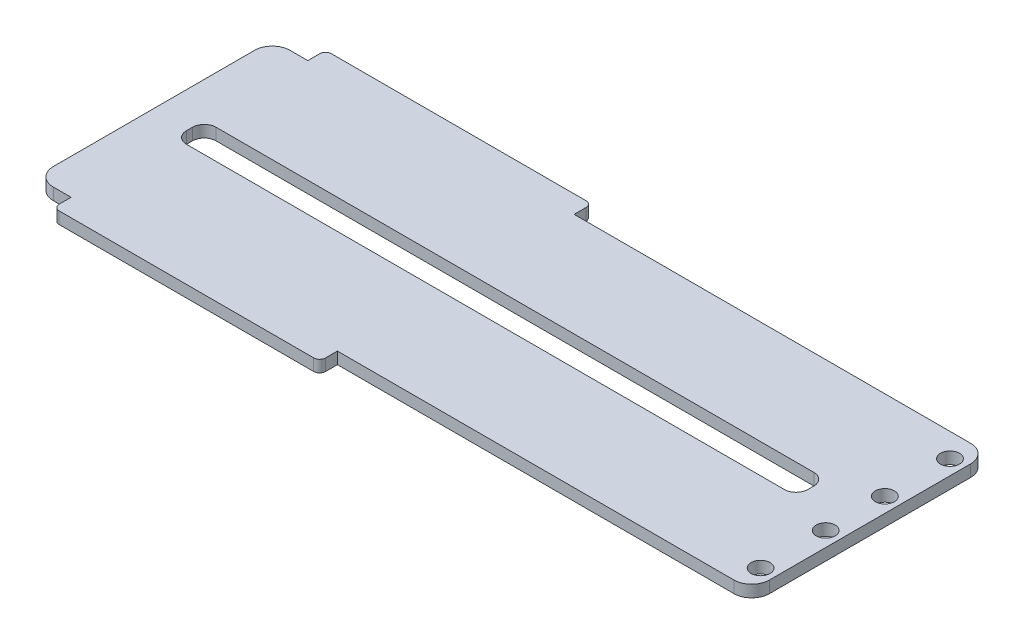
ISO-10303-21;
HEADER;
FILE_DESCRIPTION(('STEP AP214'),'2;1');
FILE_NAME('part.step','',(''),(''),'','','');
FILE_SCHEMA(('AUTOMOTIVE_DESIGN { 1 0 10303 214 1 1 1 1 }'));
ENDSEC;
DATA;
#1=APPLICATION_CONTEXT('core data for automotive mechanical design processes');
#2=APPLICATION_PROTOCOL_DEFINITION('international standard','automotive_design',2000,#1);
#3=PRODUCT_CONTEXT('',#1,'mechanical');
#4=PRODUCT('Part','Part','',(#3));
#5=PRODUCT_RELATED_PRODUCT_CATEGORY('part','',(#4));
#6=PRODUCT_DEFINITION_FORMATION('','',#4);
#7=PRODUCT_DEFINITION_CONTEXT('part definition',#1,'design');
#8=PRODUCT_DEFINITION('design','',#6,#7);
#9=PRODUCT_DEFINITION_SHAPE('','',#8);
#10=(LENGTH_UNIT() NAMED_UNIT(*) SI_UNIT(.MILLI.,.METRE.));
#11=(NAMED_UNIT(*) PLANE_ANGLE_UNIT() SI_UNIT($,.RADIAN.));
#12=(NAMED_UNIT(*) SI_UNIT($,.STERADIAN.) SOLID_ANGLE_UNIT());
#13=UNCERTAINTY_MEASURE_WITH_UNIT(LENGTH_MEASURE(1.E-05),#10,'distance_accuracy_value','');
#14=(GEOMETRIC_REPRESENTATION_CONTEXT(3) GLOBAL_UNCERTAINTY_ASSIGNED_CONTEXT((#13)) GLOBAL_UNIT_ASSIGNED_CONTEXT((#10,
#11,#12)) REPRESENTATION_CONTEXT('',''));
#15=CARTESIAN_POINT('',(0.,0.,0.));
#16=DIRECTION('',(0.,0.,1.));
#17=DIRECTION('',(1.,0.,0.));
#18=AXIS2_PLACEMENT_3D('',#15,#16,#17);
#19=CARTESIAN_POINT('',(-52.5,2.,0.));
#20=DIRECTION('',(-1.,0.,0.));
#21=DIRECTION('',(0.,0.,1.));
#22=AXIS2_PLACEMENT_3D('',#19,#20,#21);
#23=PLANE('',#22);
#24=DIRECTION('',(0.,0.,-1.));
#25=VECTOR('',#24,1.);
#26=CARTESIAN_POINT('',(-52.5,0.,0.));
#27=LINE('',#26,#25);
#28=CARTESIAN_POINT('',(-52.5,0.,0.499999999999986));
#29=VERTEX_POINT('',#28);
#30=CARTESIAN_POINT('',(-52.5,0.,-0.499999999999985));
#31=VERTEX_POINT('',#30);
#32=EDGE_CURVE('E365',#29,#31,#27,.T.);
#33=ORIENTED_EDGE('',*,*,#32,.T.);
#34=DIRECTION('',(0.,-1.,0.));
#35=VECTOR('',#34,1.);
#36=CARTESIAN_POINT('',(-52.5,2.,-0.499999999999985));
#37=LINE('',#36,#35);
#38=CARTESIAN_POINT('',(-52.5,2.,-0.499999999999985));
#39=VERTEX_POINT('',#38);
#40=EDGE_CURVE('E265',#39,#31,#37,.T.);
#41=ORIENTED_EDGE('',*,*,#40,.F.);
#42=DIRECTION('',(0.,0.,-1.));
#43=VECTOR('',#42,1.);
#44=CARTESIAN_POINT('',(-52.5,2.,0.));
#45=LINE('',#44,#43);
#46=CARTESIAN_POINT('',(-52.5,2.,0.499999999999986));
#47=VERTEX_POINT('',#46);
#48=EDGE_CURVE('E432',#47,#39,#45,.T.);
#49=ORIENTED_EDGE('',*,*,#48,.F.);
#50=DIRECTION('',(0.,-1.,0.));
#51=VECTOR('',#50,1.);
#52=CARTESIAN_POINT('',(-52.5,2.,0.499999999999986));
#53=LINE('',#52,#51);
#54=EDGE_CURVE('E251',#47,#29,#53,.T.);
#55=ORIENTED_EDGE('',*,*,#54,.T.);
#56=EDGE_LOOP('',(#33,#41,#49,#55));
#57=FACE_BOUND('',#56,.T.);
#58=ADVANCED_FACE('F37',(#57),#23,.F.);
#59=CARTESIAN_POINT('',(-50.5,2.,-0.499999999999999));
#60=DIRECTION('',(0.,-1.,0.));
#61=DIRECTION('',(0.,0.,-1.));
#62=AXIS2_PLACEMENT_3D('',#59,#60,#61);
#63=CYLINDRICAL_SURFACE('',#62,2.);
#64=CARTESIAN_POINT('',(-50.5,0.,-0.499999999999999));
#65=DIRECTION('',(0.,1.,0.));
#66=DIRECTION('',(0.,0.,1.));
#67=AXIS2_PLACEMENT_3D('',#64,#65,#66);
#68=CIRCLE('',#67,2.);
#69=CARTESIAN_POINT('',(-50.5,0.,-2.5));
#70=VERTEX_POINT('',#69);
#71=EDGE_CURVE('E368',#31,#70,#68,.F.);
#72=ORIENTED_EDGE('',*,*,#71,.T.);
#73=DIRECTION('',(0.,-1.,0.));
#74=VECTOR('',#73,1.);
#75=CARTESIAN_POINT('',(-50.5,2.,-2.5));
#76=LINE('',#75,#74);
#77=CARTESIAN_POINT('',(-50.5,2.,-2.5));
#78=VERTEX_POINT('',#77);
#79=EDGE_CURVE('E397',#78,#70,#76,.T.);
#80=ORIENTED_EDGE('',*,*,#79,.F.);
#81=CARTESIAN_POINT('',(-50.5,2.,-0.499999999999999));
#82=DIRECTION('',(0.,1.,0.));
#83=DIRECTION('',(0.,0.,1.));
#84=AXIS2_PLACEMENT_3D('',#81,#82,#83);
#85=CIRCLE('',#84,2.);
#86=EDGE_CURVE('E435',#39,#78,#85,.F.);
#87=ORIENTED_EDGE('',*,*,#86,.F.);
#88=ORIENTED_EDGE('',*,*,#40,.T.);
#89=EDGE_LOOP('',(#72,#80,#87,#88));
#90=FACE_BOUND('',#89,.T.);
#91=ADVANCED_FACE('F529',(#90),#63,.F.);
#92=CARTESIAN_POINT('',(0.,2.,-2.5));
#93=DIRECTION('',(0.,0.,-1.));
#94=DIRECTION('',(-1.,0.,0.));
#95=AXIS2_PLACEMENT_3D('',#92,#93,#94);
#96=PLANE('',#95);
#97=DIRECTION('',(1.,0.,0.));
#98=VECTOR('',#97,1.);
#99=CARTESIAN_POINT('',(0.,0.,-2.5));
#100=LINE('',#99,#98);
#101=CARTESIAN_POINT('',(50.5,0.,-2.5));
#102=VERTEX_POINT('',#101);
#103=EDGE_CURVE('E370',#70,#102,#100,.T.);
#104=ORIENTED_EDGE('',*,*,#103,.T.);
#105=DIRECTION('',(0.,-1.,0.));
#106=VECTOR('',#105,1.);
#107=CARTESIAN_POINT('',(50.5,2.,-2.5));
#108=LINE('',#107,#106);
#109=CARTESIAN_POINT('',(50.5,2.,-2.5));
#110=VERTEX_POINT('',#109);
#111=EDGE_CURVE('E394',#110,#102,#108,.T.);
#112=ORIENTED_EDGE('',*,*,#111,.F.);
#113=DIRECTION('',(1.,0.,0.));
#114=VECTOR('',#113,1.);
#115=CARTESIAN_POINT('',(0.,2.,-2.5));
#116=LINE('',#115,#114);
#117=EDGE_CURVE('E437',#78,#110,#116,.T.);
#118=ORIENTED_EDGE('',*,*,#117,.F.);
#119=ORIENTED_EDGE('',*,*,#79,.T.);
#120=EDGE_LOOP('',(#104,#112,#118,#119));
#121=FACE_BOUND('',#120,.T.);
#122=ADVANCED_FACE('F535',(#121),#96,.F.);
#123=CARTESIAN_POINT('',(50.5,2.,-0.5));
#124=DIRECTION('',(0.,-1.,0.));
#125=DIRECTION('',(0.,0.,-1.));
#126=AXIS2_PLACEMENT_3D('',#123,#124,#125);
#127=CYLINDRICAL_SURFACE('',#126,2.);
#128=CARTESIAN_POINT('',(50.5,0.,-0.5));
#129=DIRECTION('',(0.,1.,0.));
#130=DIRECTION('',(0.,0.,1.));
#131=AXIS2_PLACEMENT_3D('',#128,#129,#130);
#132=CIRCLE('',#131,2.);
#133=CARTESIAN_POINT('',(52.5,0.,-0.499999999999985));
#134=VERTEX_POINT('',#133);
#135=EDGE_CURVE('E372',#102,#134,#132,.F.);
#136=ORIENTED_EDGE('',*,*,#135,.T.);
#137=DIRECTION('',(0.,-1.,0.));
#138=VECTOR('',#137,1.);
#139=CARTESIAN_POINT('',(52.5,2.,-0.499999999999985));
#140=LINE('',#139,#138);
#141=CARTESIAN_POINT('',(52.5,2.,-0.499999999999985));
#142=VERTEX_POINT('',#141);
#143=EDGE_CURVE('E392',#142,#134,#140,.T.);
#144=ORIENTED_EDGE('',*,*,#143,.F.);
#145=CARTESIAN_POINT('',(50.5,2.,-0.5));
#146=DIRECTION('',(0.,1.,0.));
#147=DIRECTION('',(0.,0.,1.));
#148=AXIS2_PLACEMENT_3D('',#145,#146,#147);
#149=CIRCLE('',#148,2.);
#150=EDGE_CURVE('E439',#110,#142,#149,.F.);
#151=ORIENTED_EDGE('',*,*,#150,.F.);
#152=ORIENTED_EDGE('',*,*,#111,.T.);
#153=EDGE_LOOP('',(#136,#144,#151,#152));
#154=FACE_BOUND('',#153,.T.);
#155=ADVANCED_FACE('F607',(#154),#127,.F.);
#156=CARTESIAN_POINT('',(52.5,2.,0.));
#157=DIRECTION('',(-1.,0.,0.));
#158=DIRECTION('',(0.,0.,1.));
#159=AXIS2_PLACEMENT_3D('',#156,#157,#158);
#160=PLANE('',#159);
#161=DIRECTION('',(0.,0.,-1.));
#162=VECTOR('',#161,1.);
#163=CARTESIAN_POINT('',(52.5,0.,0.));
#164=LINE('',#163,#162);
#165=CARTESIAN_POINT('',(52.5,0.,0.499999999999986));
#166=VERTEX_POINT('',#165);
#167=EDGE_CURVE('E375',#166,#134,#164,.T.);
#168=ORIENTED_EDGE('',*,*,#167,.F.);
#169=DIRECTION('',(0.,-1.,0.));
#170=VECTOR('',#169,1.);
#171=CARTESIAN_POINT('',(52.5,2.,0.499999999999986));
#172=LINE('',#171,#170);
#173=CARTESIAN_POINT('',(52.5,2.,0.499999999999986));
#174=VERTEX_POINT('',#173);
#175=EDGE_CURVE('E390',#174,#166,#172,.T.);
#176=ORIENTED_EDGE('',*,*,#175,.F.);
#177=DIRECTION('',(0.,0.,-1.));
#178=VECTOR('',#177,1.);
#179=CARTESIAN_POINT('',(52.5,2.,0.));
#180=LINE('',#179,#178);
#181=EDGE_CURVE('E441',#174,#142,#180,.T.);
#182=ORIENTED_EDGE('',*,*,#181,.T.);
#183=ORIENTED_EDGE('',*,*,#143,.T.);
#184=EDGE_LOOP('',(#168,#176,#182,#183));
#185=FACE_BOUND('',#184,.T.);
#186=ADVANCED_FACE('F603',(#185),#160,.T.);
#187=CARTESIAN_POINT('',(50.5,2.,0.5));
#188=DIRECTION('',(0.,-1.,0.));
#189=DIRECTION('',(0.,0.,-1.));
#190=AXIS2_PLACEMENT_3D('',#187,#188,#189);
#191=CYLINDRICAL_SURFACE('',#190,2.);
#192=CARTESIAN_POINT('',(50.5,0.,0.5));
#193=DIRECTION('',(0.,1.,0.));
#194=DIRECTION('',(0.,0.,1.));
#195=AXIS2_PLACEMENT_3D('',#192,#193,#194);
#196=CIRCLE('',#195,2.);
#197=CARTESIAN_POINT('',(50.5,0.,2.5));
#198=VERTEX_POINT('',#197);
#199=EDGE_CURVE('E378',#198,#166,#196,.T.);
#200=ORIENTED_EDGE('',*,*,#199,.F.);
#201=DIRECTION('',(0.,-1.,0.));
#202=VECTOR('',#201,1.);
#203=CARTESIAN_POINT('',(50.5,2.,2.5));
#204=LINE('',#203,#202);
#205=CARTESIAN_POINT('',(50.5,2.,2.5));
#206=VERTEX_POINT('',#205);
#207=EDGE_CURVE('E388',#206,#198,#204,.T.);
#208=ORIENTED_EDGE('',*,*,#207,.F.);
#209=CARTESIAN_POINT('',(50.5,2.,0.5));
#210=DIRECTION('',(0.,1.,0.));
#211=DIRECTION('',(0.,0.,1.));
#212=AXIS2_PLACEMENT_3D('',#209,#210,#211);
#213=CIRCLE('',#212,2.);
#214=EDGE_CURVE('E444',#206,#174,#213,.T.);
#215=ORIENTED_EDGE('',*,*,#214,.T.);
#216=ORIENTED_EDGE('',*,*,#175,.T.);
#217=EDGE_LOOP('',(#200,#208,#215,#216));
#218=FACE_BOUND('',#217,.T.);
#219=ADVANCED_FACE('F599',(#218),#191,.F.);
#220=CARTESIAN_POINT('',(0.,2.,2.5));
#221=DIRECTION('',(0.,0.,-1.));
#222=DIRECTION('',(-1.,0.,0.));
#223=AXIS2_PLACEMENT_3D('',#220,#221,#222);
#224=PLANE('',#223);
#225=DIRECTION('',(1.,0.,0.));
#226=VECTOR('',#225,1.);
#227=CARTESIAN_POINT('',(0.,0.,2.5));
#228=LINE('',#227,#226);
#229=CARTESIAN_POINT('',(-50.5,0.,2.5));
#230=VERTEX_POINT('',#229);
#231=EDGE_CURVE('E381',#230,#198,#228,.T.);
#232=ORIENTED_EDGE('',*,*,#231,.F.);
#233=DIRECTION('',(0.,-1.,0.));
#234=VECTOR('',#233,1.);
#235=CARTESIAN_POINT('',(-50.5,2.,2.5));
#236=LINE('',#235,#234);
#237=CARTESIAN_POINT('',(-50.5,2.,2.5));
#238=VERTEX_POINT('',#237);
#239=EDGE_CURVE('E255',#238,#230,#236,.T.);
#240=ORIENTED_EDGE('',*,*,#239,.F.);
#241=DIRECTION('',(1.,0.,0.));
#242=VECTOR('',#241,1.);
#243=CARTESIAN_POINT('',(0.,2.,2.5));
#244=LINE('',#243,#242);
#245=EDGE_CURVE('E447',#238,#206,#244,.T.);
#246=ORIENTED_EDGE('',*,*,#245,.T.);
#247=ORIENTED_EDGE('',*,*,#207,.T.);
#248=EDGE_LOOP('',(#232,#240,#246,#247));
#249=FACE_BOUND('',#248,.T.);
#250=ADVANCED_FACE('F596',(#249),#224,.T.);
#251=CARTESIAN_POINT('',(0.,2.,20.));
#252=DIRECTION('',(0.,0.,-1.));
#253=DIRECTION('',(-1.,0.,0.));
#254=AXIS2_PLACEMENT_3D('',#251,#252,#253);
#255=PLANE('',#254);
#256=DIRECTION('',(1.,0.,0.));
#257=VECTOR('',#256,1.);
#258=CARTESIAN_POINT('',(0.,2.,20.));
#259=LINE('',#258,#257);
#260=CARTESIAN_POINT('',(-55.5,2.,20.));
#261=VERTEX_POINT('',#260);
#262=CARTESIAN_POINT('',(-52.5,2.,20.));
#263=VERTEX_POINT('',#262);
#264=EDGE_CURVE('E224',#261,#263,#259,.T.);
#265=ORIENTED_EDGE('',*,*,#264,.F.);
#266=DIRECTION('',(0.,1.,0.));
#267=VECTOR('',#266,1.);
#268=CARTESIAN_POINT('',(-55.5,2.,20.));
#269=LINE('',#268,#267);
#270=CARTESIAN_POINT('',(-55.5,0.,20.));
#271=VERTEX_POINT('',#270);
#272=EDGE_CURVE('E298',#261,#271,#269,.F.);
#273=ORIENTED_EDGE('',*,*,#272,.T.);
#274=DIRECTION('',(1.,0.,0.));
#275=VECTOR('',#274,1.);
#276=CARTESIAN_POINT('',(0.,0.,20.));
#277=LINE('',#276,#275);
#278=CARTESIAN_POINT('',(-52.5,0.,20.));
#279=VERTEX_POINT('',#278);
#280=EDGE_CURVE('E249',#271,#279,#277,.T.);
#281=ORIENTED_EDGE('',*,*,#280,.T.);
#282=DIRECTION('',(0.,-1.,0.));
#283=VECTOR('',#282,1.);
#284=CARTESIAN_POINT('',(-52.5,2.,20.));
#285=LINE('',#284,#283);
#286=EDGE_CURVE('E242',#263,#279,#285,.T.);
#287=ORIENTED_EDGE('',*,*,#286,.F.);
#288=EDGE_LOOP('',(#265,#273,#281,#287));
#289=FACE_BOUND('',#288,.T.);
#290=ADVANCED_FACE('F247',(#289),#255,.F.);
#291=CARTESIAN_POINT('',(-52.5,2.,-1.21430643318376E-13));
#292=DIRECTION('',(1.,0.,0.));
#293=DIRECTION('',(0.,0.,-1.));
#294=AXIS2_PLACEMENT_3D('',#291,#292,#293);
#295=PLANE('',#294);
#296=DIRECTION('',(0.,0.,1.));
#297=VECTOR('',#296,1.);
#298=CARTESIAN_POINT('',(-52.5,0.,-1.21430643318376E-13));
#299=LINE('',#298,#297);
#300=CARTESIAN_POINT('',(-52.5,0.,22.));
#301=VERTEX_POINT('',#300);
#302=EDGE_CURVE('E465',#279,#301,#299,.T.);
#303=ORIENTED_EDGE('',*,*,#302,.T.);
#304=DIRECTION('',(0.,-1.,0.));
#305=VECTOR('',#304,1.);
#306=CARTESIAN_POINT('',(-52.5,2.,22.));
#307=LINE('',#306,#305);
#308=CARTESIAN_POINT('',(-52.5,2.,22.));
#309=VERTEX_POINT('',#308);
#310=EDGE_CURVE('E244',#301,#309,#307,.F.);
#311=ORIENTED_EDGE('',*,*,#310,.T.);
#312=DIRECTION('',(0.,0.,1.));
#313=VECTOR('',#312,1.);
#314=CARTESIAN_POINT('',(-52.5,2.,-1.21430643318376E-13));
#315=LINE('',#314,#313);
#316=EDGE_CURVE('E228',#263,#309,#315,.T.);
#317=ORIENTED_EDGE('',*,*,#316,.F.);
#318=ORIENTED_EDGE('',*,*,#286,.T.);
#319=EDGE_LOOP('',(#303,#311,#317,#318));
#320=FACE_BOUND('',#319,.T.);
#321=ADVANCED_FACE('F241',(#320),#295,.F.);
#322=CARTESIAN_POINT('',(0.,2.,23.));
#323=DIRECTION('',(0.,0.,-1.));
#324=DIRECTION('',(-1.,0.,0.));
#325=AXIS2_PLACEMENT_3D('',#322,#323,#324);
#326=PLANE('',#325);
#327=DIRECTION('',(1.,0.,0.));
#328=VECTOR('',#327,1.);
#329=CARTESIAN_POINT('',(0.,2.,23.));
#330=LINE('',#329,#328);
#331=CARTESIAN_POINT('',(-51.5,2.,23.));
#332=VERTEX_POINT('',#331);
#333=CARTESIAN_POINT('',(-8.50000000000002,2.,23.));
#334=VERTEX_POINT('',#333);
#335=EDGE_CURVE('E245',#332,#334,#330,.T.);
#336=ORIENTED_EDGE('',*,*,#335,.F.);
#337=DIRECTION('',(0.,-1.,0.));
#338=VECTOR('',#337,1.);
#339=CARTESIAN_POINT('',(-51.5,2.,23.));
#340=LINE('',#339,#338);
#341=CARTESIAN_POINT('',(-51.5,0.,23.));
#342=VERTEX_POINT('',#341);
#343=EDGE_CURVE('E302',#332,#342,#340,.T.);
#344=ORIENTED_EDGE('',*,*,#343,.T.);
#345=DIRECTION('',(1.,0.,0.));
#346=VECTOR('',#345,1.);
#347=CARTESIAN_POINT('',(0.,0.,23.));
#348=LINE('',#347,#346);
#349=CARTESIAN_POINT('',(-8.50000000000002,0.,23.));
#350=VERTEX_POINT('',#349);
#351=EDGE_CURVE('E467',#342,#350,#348,.T.);
#352=ORIENTED_EDGE('',*,*,#351,.T.);
#353=DIRECTION('',(0.,-1.,0.));
#354=VECTOR('',#353,1.);
#355=CARTESIAN_POINT('',(-8.50000000000002,2.,23.));
#356=LINE('',#355,#354);
#357=EDGE_CURVE('E300',#350,#334,#356,.F.);
#358=ORIENTED_EDGE('',*,*,#357,.T.);
#359=EDGE_LOOP('',(#336,#344,#352,#358));
#360=FACE_BOUND('',#359,.T.);
#361=ADVANCED_FACE('F556',(#360),#326,.F.);
#362=CARTESIAN_POINT('',(-7.50000000000003,2.,0.));
#363=DIRECTION('',(1.,0.,0.));
#364=DIRECTION('',(0.,0.,-1.));
#365=AXIS2_PLACEMENT_3D('',#362,#363,#364);
#366=PLANE('',#365);
#367=DIRECTION('',(0.,0.,1.));
#368=VECTOR('',#367,1.);
#369=CARTESIAN_POINT('',(-7.50000000000003,2.,0.));
#370=LINE('',#369,#368);
#371=CARTESIAN_POINT('',(-7.50000000000002,2.,20.));
#372=VERTEX_POINT('',#371);
#373=CARTESIAN_POINT('',(-7.50000000000002,2.,22.));
#374=VERTEX_POINT('',#373);
#375=EDGE_CURVE('E493',#372,#374,#370,.T.);
#376=ORIENTED_EDGE('',*,*,#375,.T.);
#377=DIRECTION('',(0.,-1.,0.));
#378=VECTOR('',#377,1.);
#379=CARTESIAN_POINT('',(-7.50000000000002,0.,22.));
#380=LINE('',#379,#378);
#381=CARTESIAN_POINT('',(-7.50000000000002,0.,22.));
#382=VERTEX_POINT('',#381);
#383=EDGE_CURVE('E320',#374,#382,#380,.T.);
#384=ORIENTED_EDGE('',*,*,#383,.T.);
#385=DIRECTION('',(0.,0.,1.));
#386=VECTOR('',#385,1.);
#387=CARTESIAN_POINT('',(-7.50000000000003,0.,0.));
#388=LINE('',#387,#386);
#389=CARTESIAN_POINT('',(-7.50000000000002,0.,20.));
#390=VERTEX_POINT('',#389);
#391=EDGE_CURVE('E470',#390,#382,#388,.T.);
#392=ORIENTED_EDGE('',*,*,#391,.F.);
#393=DIRECTION('',(0.,-1.,0.));
#394=VECTOR('',#393,1.);
#395=CARTESIAN_POINT('',(-7.50000000000002,2.,20.));
#396=LINE('',#395,#394);
#397=EDGE_CURVE('E252',#372,#390,#396,.T.);
#398=ORIENTED_EDGE('',*,*,#397,.F.);
#399=EDGE_LOOP('',(#376,#384,#392,#398));
#400=FACE_BOUND('',#399,.T.);
#401=ADVANCED_FACE('F553',(#400),#366,.T.);
#402=CARTESIAN_POINT('',(59.5,0.,20.));
#403=VERTEX_POINT('',#402);
#404=EDGE_CURVE('E412',#390,#403,#277,.T.);
#405=ORIENTED_EDGE('',*,*,#404,.T.);
#406=DIRECTION('',(0.,-1.,0.));
#407=VECTOR('',#406,1.);
#408=CARTESIAN_POINT('',(59.5,2.,20.));
#409=LINE('',#408,#407);
#410=CARTESIAN_POINT('',(59.5,2.,20.));
#411=VERTEX_POINT('',#410);
#412=EDGE_CURVE('E278',#403,#411,#409,.F.);
#413=ORIENTED_EDGE('',*,*,#412,.T.);
#414=EDGE_CURVE('E237',#372,#411,#259,.T.);
#415=ORIENTED_EDGE('',*,*,#414,.F.);
#416=ORIENTED_EDGE('',*,*,#397,.T.);
#417=EDGE_LOOP('',(#405,#413,#415,#416));
#418=FACE_BOUND('',#417,.T.);
#419=ADVANCED_FACE('F477',(#418),#255,.F.);
#420=CARTESIAN_POINT('',(62.5,2.,0.));
#421=DIRECTION('',(-1.,0.,0.));
#422=DIRECTION('',(0.,0.,1.));
#423=AXIS2_PLACEMENT_3D('',#420,#421,#422);
#424=PLANE('',#423);
#425=DIRECTION('',(0.,0.,-1.));
#426=VECTOR('',#425,1.);
#427=CARTESIAN_POINT('',(62.5,2.,0.));
#428=LINE('',#427,#426);
#429=CARTESIAN_POINT('',(62.5,2.,17.));
#430=VERTEX_POINT('',#429);
#431=CARTESIAN_POINT('',(62.5,2.,-17.));
#432=VERTEX_POINT('',#431);
#433=EDGE_CURVE('E486',#430,#432,#428,.T.);
#434=ORIENTED_EDGE('',*,*,#433,.F.);
#435=DIRECTION('',(0.,-1.,0.));
#436=VECTOR('',#435,1.);
#437=CARTESIAN_POINT('',(62.5,2.,17.));
#438=LINE('',#437,#436);
#439=CARTESIAN_POINT('',(62.5,0.,17.));
#440=VERTEX_POINT('',#439);
#441=EDGE_CURVE('E267',#430,#440,#438,.T.);
#442=ORIENTED_EDGE('',*,*,#441,.T.);
#443=DIRECTION('',(0.,0.,-1.));
#444=VECTOR('',#443,1.);
#445=CARTESIAN_POINT('',(62.5,0.,0.));
#446=LINE('',#445,#444);
#447=CARTESIAN_POINT('',(62.5,0.,-17.));
#448=VERTEX_POINT('',#447);
#449=EDGE_CURVE('E410',#440,#448,#446,.T.);
#450=ORIENTED_EDGE('',*,*,#449,.T.);
#451=DIRECTION('',(0.,-1.,0.));
#452=VECTOR('',#451,1.);
#453=CARTESIAN_POINT('',(62.5,2.,-17.));
#454=LINE('',#453,#452);
#455=EDGE_CURVE('E264',#448,#432,#454,.F.);
#456=ORIENTED_EDGE('',*,*,#455,.T.);
#457=EDGE_LOOP('',(#434,#442,#450,#456));
#458=FACE_BOUND('',#457,.T.);
#459=ADVANCED_FACE('F489',(#458),#424,.F.);
#460=CARTESIAN_POINT('',(0.,2.,-20.));
#461=DIRECTION('',(0.,0.,-1.));
#462=DIRECTION('',(-1.,0.,0.));
#463=AXIS2_PLACEMENT_3D('',#460,#461,#462);
#464=PLANE('',#463);
#465=DIRECTION('',(1.,0.,0.));
#466=VECTOR('',#465,1.);
#467=CARTESIAN_POINT('',(0.,2.,-20.));
#468=LINE('',#467,#466);
#469=CARTESIAN_POINT('',(-7.50000000000002,2.,-20.));
#470=VERTEX_POINT('',#469);
#471=CARTESIAN_POINT('',(59.5,2.,-20.));
#472=VERTEX_POINT('',#471);
#473=EDGE_CURVE('E341',#470,#472,#468,.T.);
#474=ORIENTED_EDGE('',*,*,#473,.T.);
#475=DIRECTION('',(0.,-1.,0.));
#476=VECTOR('',#475,1.);
#477=CARTESIAN_POINT('',(59.5,0.,-20.));
#478=LINE('',#477,#476);
#479=CARTESIAN_POINT('',(59.5,0.,-20.));
#480=VERTEX_POINT('',#479);
#481=EDGE_CURVE('E287',#472,#480,#478,.T.);
#482=ORIENTED_EDGE('',*,*,#481,.T.);
#483=DIRECTION('',(1.,0.,0.));
#484=VECTOR('',#483,1.);
#485=CARTESIAN_POINT('',(0.,0.,-20.));
#486=LINE('',#485,#484);
#487=CARTESIAN_POINT('',(-7.50000000000002,0.,-20.));
#488=VERTEX_POINT('',#487);
#489=EDGE_CURVE('E361',#488,#480,#486,.T.);
#490=ORIENTED_EDGE('',*,*,#489,.F.);
#491=DIRECTION('',(0.,-1.,0.));
#492=VECTOR('',#491,1.);
#493=CARTESIAN_POINT('',(-7.50000000000002,2.,-20.));
#494=LINE('',#493,#492);
#495=EDGE_CURVE('E257',#470,#488,#494,.T.);
#496=ORIENTED_EDGE('',*,*,#495,.F.);
#497=EDGE_LOOP('',(#474,#482,#490,#496));
#498=FACE_BOUND('',#497,.T.);
#499=ADVANCED_FACE('F408',(#498),#464,.T.);
#500=CARTESIAN_POINT('',(-7.50000000000002,2.,0.));
#501=DIRECTION('',(-1.,0.,0.));
#502=DIRECTION('',(0.,0.,1.));
#503=AXIS2_PLACEMENT_3D('',#500,#501,#502);
#504=PLANE('',#503);
#505=DIRECTION('',(0.,0.,-1.));
#506=VECTOR('',#505,1.);
#507=CARTESIAN_POINT('',(-7.50000000000002,0.,0.));
#508=LINE('',#507,#506);
#509=CARTESIAN_POINT('',(-7.50000000000002,0.,-22.));
#510=VERTEX_POINT('',#509);
#511=EDGE_CURVE('E336',#488,#510,#508,.T.);
#512=ORIENTED_EDGE('',*,*,#511,.T.);
#513=DIRECTION('',(0.,-1.,0.));
#514=VECTOR('',#513,1.);
#515=CARTESIAN_POINT('',(-7.50000000000002,2.,-22.));
#516=LINE('',#515,#514);
#517=CARTESIAN_POINT('',(-7.50000000000002,2.,-22.));
#518=VERTEX_POINT('',#517);
#519=EDGE_CURVE('E45',#510,#518,#516,.F.);
#520=ORIENTED_EDGE('',*,*,#519,.T.);
#521=DIRECTION('',(0.,0.,-1.));
#522=VECTOR('',#521,1.);
#523=CARTESIAN_POINT('',(-7.50000000000002,2.,0.));
#524=LINE('',#523,#522);
#525=EDGE_CURVE('E333',#470,#518,#524,.T.);
#526=ORIENTED_EDGE('',*,*,#525,.F.);
#527=ORIENTED_EDGE('',*,*,#495,.T.);
#528=EDGE_LOOP('',(#512,#520,#526,#527));
#529=FACE_BOUND('',#528,.T.);
#530=ADVANCED_FACE('F332',(#529),#504,.F.);
#531=CARTESIAN_POINT('',(0.,2.,-23.));
#532=DIRECTION('',(0.,0.,-1.));
#533=DIRECTION('',(-1.,0.,0.));
#534=AXIS2_PLACEMENT_3D('',#531,#532,#533);
#535=PLANE('',#534);
#536=DIRECTION('',(1.,0.,0.));
#537=VECTOR('',#536,1.);
#538=CARTESIAN_POINT('',(0.,2.,-23.));
#539=LINE('',#538,#537);
#540=CARTESIAN_POINT('',(-51.5,2.,-23.));
#541=VERTEX_POINT('',#540);
#542=CARTESIAN_POINT('',(-8.50000000000002,2.,-23.));
#543=VERTEX_POINT('',#542);
#544=EDGE_CURVE('E342',#541,#543,#539,.T.);
#545=ORIENTED_EDGE('',*,*,#544,.T.);
#546=DIRECTION('',(0.,-1.,0.));
#547=VECTOR('',#546,1.);
#548=CARTESIAN_POINT('',(-8.50000000000002,0.,-23.));
#549=LINE('',#548,#547);
#550=CARTESIAN_POINT('',(-8.50000000000002,0.,-23.));
#551=VERTEX_POINT('',#550);
#552=EDGE_CURVE('E325',#543,#551,#549,.T.);
#553=ORIENTED_EDGE('',*,*,#552,.T.);
#554=DIRECTION('',(1.,0.,0.));
#555=VECTOR('',#554,1.);
#556=CARTESIAN_POINT('',(0.,0.,-23.));
#557=LINE('',#556,#555);
#558=CARTESIAN_POINT('',(-51.5,0.,-23.));
#559=VERTEX_POINT('',#558);
#560=EDGE_CURVE('E350',#559,#551,#557,.T.);
#561=ORIENTED_EDGE('',*,*,#560,.F.);
#562=DIRECTION('',(0.,-1.,0.));
#563=VECTOR('',#562,1.);
#564=CARTESIAN_POINT('',(-51.5,2.,-23.));
#565=LINE('',#564,#563);
#566=EDGE_CURVE('E323',#559,#541,#565,.F.);
#567=ORIENTED_EDGE('',*,*,#566,.T.);
#568=EDGE_LOOP('',(#545,#553,#561,#567));
#569=FACE_BOUND('',#568,.T.);
#570=ADVANCED_FACE('F349',(#569),#535,.T.);
#571=CARTESIAN_POINT('',(-52.5,2.,1.21430643318376E-13));
#572=DIRECTION('',(-1.,0.,0.));
#573=DIRECTION('',(0.,0.,1.));
#574=AXIS2_PLACEMENT_3D('',#571,#572,#573);
#575=PLANE('',#574);
#576=DIRECTION('',(0.,0.,-1.));
#577=VECTOR('',#576,1.);
#578=CARTESIAN_POINT('',(-52.5,2.,1.21430643318376E-13));
#579=LINE('',#578,#577);
#580=CARTESIAN_POINT('',(-52.5,2.,-20.));
#581=VERTEX_POINT('',#580);
#582=CARTESIAN_POINT('',(-52.5,2.,-22.));
#583=VERTEX_POINT('',#582);
#584=EDGE_CURVE('E426',#581,#583,#579,.T.);
#585=ORIENTED_EDGE('',*,*,#584,.T.);
#586=DIRECTION('',(0.,-1.,0.));
#587=VECTOR('',#586,1.);
#588=CARTESIAN_POINT('',(-52.5,2.,-22.));
#589=LINE('',#588,#587);
#590=CARTESIAN_POINT('',(-52.5,0.,-22.));
#591=VERTEX_POINT('',#590);
#592=EDGE_CURVE('E11',#583,#591,#589,.T.);
#593=ORIENTED_EDGE('',*,*,#592,.T.);
#594=DIRECTION('',(0.,0.,-1.));
#595=VECTOR('',#594,1.);
#596=CARTESIAN_POINT('',(-52.5,0.,1.21430643318376E-13));
#597=LINE('',#596,#595);
#598=CARTESIAN_POINT('',(-52.5,0.,-20.));
#599=VERTEX_POINT('',#598);
#600=EDGE_CURVE('E357',#599,#591,#597,.T.);
#601=ORIENTED_EDGE('',*,*,#600,.F.);
#602=DIRECTION('',(0.,-1.,0.));
#603=VECTOR('',#602,1.);
#604=CARTESIAN_POINT('',(-52.5,2.,-20.));
#605=LINE('',#604,#603);
#606=EDGE_CURVE('E402',#581,#599,#605,.T.);
#607=ORIENTED_EDGE('',*,*,#606,.F.);
#608=EDGE_LOOP('',(#585,#593,#601,#607));
#609=FACE_BOUND('',#608,.T.);
#610=ADVANCED_FACE('F424',(#609),#575,.T.);
#611=CARTESIAN_POINT('',(-55.5,0.,-20.));
#612=VERTEX_POINT('',#611);
#613=EDGE_CURVE('E359',#612,#599,#486,.T.);
#614=ORIENTED_EDGE('',*,*,#613,.F.);
#615=DIRECTION('',(0.,1.,0.));
#616=VECTOR('',#615,1.);
#617=CARTESIAN_POINT('',(-55.5,2.,-20.));
#618=LINE('',#617,#616);
#619=CARTESIAN_POINT('',(-55.5,2.,-20.));
#620=VERTEX_POINT('',#619);
#621=EDGE_CURVE('E290',#612,#620,#618,.T.);
#622=ORIENTED_EDGE('',*,*,#621,.T.);
#623=EDGE_CURVE('E422',#620,#581,#468,.T.);
#624=ORIENTED_EDGE('',*,*,#623,.T.);
#625=ORIENTED_EDGE('',*,*,#606,.T.);
#626=EDGE_LOOP('',(#614,#622,#624,#625));
#627=FACE_BOUND('',#626,.T.);
#628=ADVANCED_FACE('F420',(#627),#464,.T.);
#629=CARTESIAN_POINT('',(60.,2.,-16.));
#630=DIRECTION('',(0.,-1.,0.));
#631=DIRECTION('',(0.,0.,-1.));
#632=AXIS2_PLACEMENT_3D('',#629,#630,#631);
#633=CYLINDRICAL_SURFACE('',#632,1.6);
#634=CARTESIAN_POINT('',(60.,2.,-16.));
#635=DIRECTION('',(0.,1.,0.));
#636=DIRECTION('',(0.,0.,1.));
#637=AXIS2_PLACEMENT_3D('',#634,#635,#636);
#638=CIRCLE('',#637,1.6);
#639=CARTESIAN_POINT('',(60.,2.,-14.4));
#640=VERTEX_POINT('',#639);
#641=EDGE_CURVE('E235',#640,#640,#638,.T.);
#642=ORIENTED_EDGE('',*,*,#641,.T.);
#643=EDGE_LOOP('',(#642));
#644=FACE_BOUND('',#643,.T.);
#645=CARTESIAN_POINT('',(60.,0.,-16.));
#646=DIRECTION('',(0.,1.,0.));
#647=DIRECTION('',(0.,0.,1.));
#648=AXIS2_PLACEMENT_3D('',#645,#646,#647);
#649=CIRCLE('',#648,1.6);
#650=CARTESIAN_POINT('',(60.,0.,-14.4));
#651=VERTEX_POINT('',#650);
#652=EDGE_CURVE('E461',#651,#651,#649,.T.);
#653=ORIENTED_EDGE('',*,*,#652,.F.);
#654=EDGE_LOOP('',(#653));
#655=FACE_BOUND('',#654,.T.);
#656=ADVANCED_FACE('F542',(#644,#655),#633,.F.);
#657=CARTESIAN_POINT('',(60.,2.,-5.));
#658=DIRECTION('',(0.,-1.,0.));
#659=DIRECTION('',(0.,0.,-1.));
#660=AXIS2_PLACEMENT_3D('',#657,#658,#659);
#661=CYLINDRICAL_SURFACE('',#660,1.6);
#662=CARTESIAN_POINT('',(60.,2.,-5.));
#663=DIRECTION('',(0.,1.,0.));
#664=DIRECTION('',(0.,0.,1.));
#665=AXIS2_PLACEMENT_3D('',#662,#663,#664);
#666=CIRCLE('',#665,1.6);
#667=CARTESIAN_POINT('',(60.,2.,-3.4));
#668=VERTEX_POINT('',#667);
#669=EDGE_CURVE('E499',#668,#668,#666,.T.);
#670=ORIENTED_EDGE('',*,*,#669,.T.);
#671=EDGE_LOOP('',(#670));
#672=FACE_BOUND('',#671,.T.);
#673=CARTESIAN_POINT('',(60.,0.,-5.));
#674=DIRECTION('',(0.,1.,0.));
#675=DIRECTION('',(0.,0.,1.));
#676=AXIS2_PLACEMENT_3D('',#673,#674,#675);
#677=CIRCLE('',#676,1.6);
#678=CARTESIAN_POINT('',(60.,0.,-3.4));
#679=VERTEX_POINT('',#678);
#680=EDGE_CURVE('E458',#679,#679,#677,.T.);
#681=ORIENTED_EDGE('',*,*,#680,.F.);
#682=EDGE_LOOP('',(#681));
#683=FACE_BOUND('',#682,.T.);
#684=ADVANCED_FACE('F565',(#672,#683),#661,.F.);
#685=CARTESIAN_POINT('',(60.,2.,5.));
#686=DIRECTION('',(0.,-1.,0.));
#687=DIRECTION('',(0.,0.,-1.));
#688=AXIS2_PLACEMENT_3D('',#685,#686,#687);
#689=CYLINDRICAL_SURFACE('',#688,1.6);
#690=CARTESIAN_POINT('',(60.,2.,5.));
#691=DIRECTION('',(0.,1.,0.));
#692=DIRECTION('',(0.,0.,1.));
#693=AXIS2_PLACEMENT_3D('',#690,#691,#692);
#694=CIRCLE('',#693,1.6);
#695=CARTESIAN_POINT('',(60.,2.,6.6));
#696=VERTEX_POINT('',#695);
#697=EDGE_CURVE('E502',#696,#696,#694,.T.);
#698=ORIENTED_EDGE('',*,*,#697,.T.);
#699=EDGE_LOOP('',(#698));
#700=FACE_BOUND('',#699,.T.);
#701=CARTESIAN_POINT('',(60.,0.,5.));
#702=DIRECTION('',(0.,1.,0.));
#703=DIRECTION('',(0.,0.,1.));
#704=AXIS2_PLACEMENT_3D('',#701,#702,#703);
#705=CIRCLE('',#704,1.6);
#706=CARTESIAN_POINT('',(60.,0.,6.6));
#707=VERTEX_POINT('',#706);
#708=EDGE_CURVE('E454',#707,#707,#705,.T.);
#709=ORIENTED_EDGE('',*,*,#708,.F.);
#710=EDGE_LOOP('',(#709));
#711=FACE_BOUND('',#710,.T.);
#712=ADVANCED_FACE('F569',(#700,#711),#689,.F.);
#713=CARTESIAN_POINT('',(60.,2.,16.));
#714=DIRECTION('',(0.,-1.,0.));
#715=DIRECTION('',(0.,0.,-1.));
#716=AXIS2_PLACEMENT_3D('',#713,#714,#715);
#717=CYLINDRICAL_SURFACE('',#716,1.6);
#718=CARTESIAN_POINT('',(60.,2.,16.));
#719=DIRECTION('',(0.,1.,0.));
#720=DIRECTION('',(0.,0.,1.));
#721=AXIS2_PLACEMENT_3D('',#718,#719,#720);
#722=CIRCLE('',#721,1.6);
#723=CARTESIAN_POINT('',(60.,2.,17.6));
#724=VERTEX_POINT('',#723);
#725=EDGE_CURVE('E385',#724,#724,#722,.T.);
#726=ORIENTED_EDGE('',*,*,#725,.T.);
#727=EDGE_LOOP('',(#726));
#728=FACE_BOUND('',#727,.T.);
#729=CARTESIAN_POINT('',(60.,0.,16.));
#730=DIRECTION('',(0.,1.,0.));
#731=DIRECTION('',(0.,0.,1.));
#732=AXIS2_PLACEMENT_3D('',#729,#730,#731);
#733=CIRCLE('',#732,1.6);
#734=CARTESIAN_POINT('',(60.,0.,17.6));
#735=VERTEX_POINT('',#734);
#736=EDGE_CURVE('E451',#735,#735,#733,.T.);
#737=ORIENTED_EDGE('',*,*,#736,.F.);
#738=EDGE_LOOP('',(#737));
#739=FACE_BOUND('',#738,.T.);
#740=ADVANCED_FACE('F573',(#728,#739),#717,.F.);
#741=CARTESIAN_POINT('',(-50.5,2.,0.5));
#742=DIRECTION('',(0.,-1.,0.));
#743=DIRECTION('',(0.,0.,-1.));
#744=AXIS2_PLACEMENT_3D('',#741,#742,#743);
#745=CYLINDRICAL_SURFACE('',#744,2.);
#746=CARTESIAN_POINT('',(-50.5,0.,0.5));
#747=DIRECTION('',(0.,1.,0.));
#748=DIRECTION('',(0.,0.,1.));
#749=AXIS2_PLACEMENT_3D('',#746,#747,#748);
#750=CIRCLE('',#749,2.);
#751=EDGE_CURVE('E384',#230,#29,#750,.F.);
#752=ORIENTED_EDGE('',*,*,#751,.T.);
#753=ORIENTED_EDGE('',*,*,#54,.F.);
#754=CARTESIAN_POINT('',(-50.5,2.,0.5));
#755=DIRECTION('',(0.,1.,0.));
#756=DIRECTION('',(0.,0.,1.));
#757=AXIS2_PLACEMENT_3D('',#754,#755,#756);
#758=CIRCLE('',#757,2.);
#759=EDGE_CURVE('E404',#238,#47,#758,.F.);
#760=ORIENTED_EDGE('',*,*,#759,.F.);
#761=ORIENTED_EDGE('',*,*,#239,.T.);
#762=EDGE_LOOP('',(#752,#753,#760,#761));
#763=FACE_BOUND('',#762,.T.);
#764=ADVANCED_FACE('F577',(#763),#745,.F.);
#765=CARTESIAN_POINT('',(0.,2.,0.));
#766=DIRECTION('',(0.,1.,0.));
#767=DIRECTION('',(0.,0.,1.));
#768=AXIS2_PLACEMENT_3D('',#765,#766,#767);
#769=PLANE('',#768);
#770=ORIENTED_EDGE('',*,*,#316,.T.);
#771=CARTESIAN_POINT('',(-51.5,2.,22.));
#772=DIRECTION('',(0.,1.,0.));
#773=DIRECTION('',(0.,0.,1.));
#774=AXIS2_PLACEMENT_3D('',#771,#772,#773);
#775=CIRCLE('',#774,1.);
#776=EDGE_CURVE('E318',#309,#332,#775,.T.);
#777=ORIENTED_EDGE('',*,*,#776,.T.);
#778=ORIENTED_EDGE('',*,*,#335,.T.);
#779=CARTESIAN_POINT('',(-8.50000000000002,2.,22.));
#780=DIRECTION('',(0.,1.,0.));
#781=DIRECTION('',(0.,0.,1.));
#782=AXIS2_PLACEMENT_3D('',#779,#780,#781);
#783=CIRCLE('',#782,1.);
#784=EDGE_CURVE('E52',#334,#374,#783,.T.);
#785=ORIENTED_EDGE('',*,*,#784,.T.);
#786=ORIENTED_EDGE('',*,*,#375,.F.);
#787=ORIENTED_EDGE('',*,*,#414,.T.);
#788=CARTESIAN_POINT('',(59.5,2.,17.));
#789=DIRECTION('',(0.,1.,0.));
#790=DIRECTION('',(0.,0.,1.));
#791=AXIS2_PLACEMENT_3D('',#788,#789,#790);
#792=CIRCLE('',#791,3.);
#793=EDGE_CURVE('E285',#411,#430,#792,.T.);
#794=ORIENTED_EDGE('',*,*,#793,.T.);
#795=ORIENTED_EDGE('',*,*,#433,.T.);
#796=CARTESIAN_POINT('',(59.5,2.,-17.));
#797=DIRECTION('',(0.,1.,0.));
#798=DIRECTION('',(0.,0.,1.));
#799=AXIS2_PLACEMENT_3D('',#796,#797,#798);
#800=CIRCLE('',#799,3.);
#801=EDGE_CURVE('E283',#432,#472,#800,.T.);
#802=ORIENTED_EDGE('',*,*,#801,.T.);
#803=ORIENTED_EDGE('',*,*,#473,.F.);
#804=ORIENTED_EDGE('',*,*,#525,.T.);
#805=CARTESIAN_POINT('',(-8.50000000000002,2.,-22.));
#806=DIRECTION('',(0.,1.,0.));
#807=DIRECTION('',(0.,0.,1.));
#808=AXIS2_PLACEMENT_3D('',#805,#806,#807);
#809=CIRCLE('',#808,1.);
#810=EDGE_CURVE('E315',#518,#543,#809,.T.);
#811=ORIENTED_EDGE('',*,*,#810,.T.);
#812=ORIENTED_EDGE('',*,*,#544,.F.);
#813=CARTESIAN_POINT('',(-51.5,2.,-22.));
#814=DIRECTION('',(0.,1.,0.));
#815=DIRECTION('',(0.,0.,1.));
#816=AXIS2_PLACEMENT_3D('',#813,#814,#815);
#817=CIRCLE('',#816,1.);
#818=EDGE_CURVE('E59',#541,#583,#817,.T.);
#819=ORIENTED_EDGE('',*,*,#818,.T.);
#820=ORIENTED_EDGE('',*,*,#584,.F.);
#821=ORIENTED_EDGE('',*,*,#623,.F.);
#822=CARTESIAN_POINT('',(-55.5,2.,-17.));
#823=DIRECTION('',(0.,1.,0.));
#824=DIRECTION('',(0.,0.,1.));
#825=AXIS2_PLACEMENT_3D('',#822,#823,#824);
#826=CIRCLE('',#825,3.);
#827=CARTESIAN_POINT('',(-58.5,2.,-17.));
#828=VERTEX_POINT('',#827);
#829=EDGE_CURVE('E281',#620,#828,#826,.T.);
#830=ORIENTED_EDGE('',*,*,#829,.T.);
#831=DIRECTION('',(0.,0.,-1.));
#832=VECTOR('',#831,1.);
#833=CARTESIAN_POINT('',(-58.5,2.,-20.));
#834=LINE('',#833,#832);
#835=CARTESIAN_POINT('',(-58.5,2.,17.));
#836=VERTEX_POINT('',#835);
#837=EDGE_CURVE('E455',#836,#828,#834,.T.);
#838=ORIENTED_EDGE('',*,*,#837,.F.);
#839=CARTESIAN_POINT('',(-55.5,2.,17.));
#840=DIRECTION('',(0.,1.,0.));
#841=DIRECTION('',(0.,0.,1.));
#842=AXIS2_PLACEMENT_3D('',#839,#840,#841);
#843=CIRCLE('',#842,3.);
#844=EDGE_CURVE('E231',#836,#261,#843,.T.);
#845=ORIENTED_EDGE('',*,*,#844,.T.);
#846=ORIENTED_EDGE('',*,*,#264,.T.);
#847=EDGE_LOOP('',(#770,#777,#778,#785,#786,#787,#794,#795,#802,#803,#804,#811,#812,#819,#820,
#821,#830,#838,#845,#846));
#848=FACE_BOUND('',#847,.T.);
#849=ORIENTED_EDGE('',*,*,#725,.F.);
#850=EDGE_LOOP('',(#849));
#851=FACE_BOUND('',#850,.T.);
#852=ORIENTED_EDGE('',*,*,#697,.F.);
#853=EDGE_LOOP('',(#852));
#854=FACE_BOUND('',#853,.T.);
#855=ORIENTED_EDGE('',*,*,#669,.F.);
#856=EDGE_LOOP('',(#855));
#857=FACE_BOUND('',#856,.T.);
#858=ORIENTED_EDGE('',*,*,#641,.F.);
#859=EDGE_LOOP('',(#858));
#860=FACE_BOUND('',#859,.T.);
#861=ORIENTED_EDGE('',*,*,#48,.T.);
#862=ORIENTED_EDGE('',*,*,#86,.T.);
#863=ORIENTED_EDGE('',*,*,#117,.T.);
#864=ORIENTED_EDGE('',*,*,#150,.T.);
#865=ORIENTED_EDGE('',*,*,#181,.F.);
#866=ORIENTED_EDGE('',*,*,#214,.F.);
#867=ORIENTED_EDGE('',*,*,#245,.F.);
#868=ORIENTED_EDGE('',*,*,#759,.T.);
#869=EDGE_LOOP('',(#861,#862,#863,#864,#865,#866,#867,#868));
#870=FACE_BOUND('',#869,.T.);
#871=ADVANCED_FACE('F226',(#848,#851,#854,#857,#860,#870),#769,.T.);
#872=CARTESIAN_POINT('',(0.,0.,0.));
#873=DIRECTION('',(0.,1.,0.));
#874=DIRECTION('',(0.,0.,1.));
#875=AXIS2_PLACEMENT_3D('',#872,#873,#874);
#876=PLANE('',#875);
#877=ORIENTED_EDGE('',*,*,#736,.T.);
#878=EDGE_LOOP('',(#877));
#879=FACE_BOUND('',#878,.T.);
#880=ORIENTED_EDGE('',*,*,#708,.T.);
#881=EDGE_LOOP('',(#880));
#882=FACE_BOUND('',#881,.T.);
#883=ORIENTED_EDGE('',*,*,#680,.T.);
#884=EDGE_LOOP('',(#883));
#885=FACE_BOUND('',#884,.T.);
#886=ORIENTED_EDGE('',*,*,#652,.T.);
#887=EDGE_LOOP('',(#886));
#888=FACE_BOUND('',#887,.T.);
#889=ORIENTED_EDGE('',*,*,#351,.F.);
#890=CARTESIAN_POINT('',(-51.5,0.,22.));
#891=DIRECTION('',(0.,1.,0.));
#892=DIRECTION('',(0.,0.,1.));
#893=AXIS2_PLACEMENT_3D('',#890,#891,#892);
#894=CIRCLE('',#893,1.);
#895=EDGE_CURVE('E311',#342,#301,#894,.F.);
#896=ORIENTED_EDGE('',*,*,#895,.T.);
#897=ORIENTED_EDGE('',*,*,#302,.F.);
#898=ORIENTED_EDGE('',*,*,#280,.F.);
#899=CARTESIAN_POINT('',(-55.5,0.,17.));
#900=DIRECTION('',(0.,1.,0.));
#901=DIRECTION('',(0.,0.,1.));
#902=AXIS2_PLACEMENT_3D('',#899,#900,#901);
#903=CIRCLE('',#902,3.);
#904=CARTESIAN_POINT('',(-58.5,0.,17.));
#905=VERTEX_POINT('',#904);
#906=EDGE_CURVE('E270',#271,#905,#903,.F.);
#907=ORIENTED_EDGE('',*,*,#906,.T.);
#908=DIRECTION('',(0.,0.,-1.));
#909=VECTOR('',#908,1.);
#910=CARTESIAN_POINT('',(-58.5,0.,0.));
#911=LINE('',#910,#909);
#912=CARTESIAN_POINT('',(-58.5,0.,-17.));
#913=VERTEX_POINT('',#912);
#914=EDGE_CURVE('E261',#905,#913,#911,.T.);
#915=ORIENTED_EDGE('',*,*,#914,.T.);
#916=CARTESIAN_POINT('',(-55.5,0.,-17.));
#917=DIRECTION('',(0.,1.,0.));
#918=DIRECTION('',(0.,0.,1.));
#919=AXIS2_PLACEMENT_3D('',#916,#917,#918);
#920=CIRCLE('',#919,3.);
#921=EDGE_CURVE('E272',#913,#612,#920,.F.);
#922=ORIENTED_EDGE('',*,*,#921,.T.);
#923=ORIENTED_EDGE('',*,*,#613,.T.);
#924=ORIENTED_EDGE('',*,*,#600,.T.);
#925=CARTESIAN_POINT('',(-51.5,0.,-22.));
#926=DIRECTION('',(0.,1.,0.));
#927=DIRECTION('',(0.,0.,1.));
#928=AXIS2_PLACEMENT_3D('',#925,#926,#927);
#929=CIRCLE('',#928,1.);
#930=EDGE_CURVE('E305',#591,#559,#929,.F.);
#931=ORIENTED_EDGE('',*,*,#930,.T.);
#932=ORIENTED_EDGE('',*,*,#560,.T.);
#933=CARTESIAN_POINT('',(-8.50000000000002,0.,-22.));
#934=DIRECTION('',(0.,1.,0.));
#935=DIRECTION('',(0.,0.,1.));
#936=AXIS2_PLACEMENT_3D('',#933,#934,#935);
#937=CIRCLE('',#936,1.);
#938=EDGE_CURVE('E307',#551,#510,#937,.F.);
#939=ORIENTED_EDGE('',*,*,#938,.T.);
#940=ORIENTED_EDGE('',*,*,#511,.F.);
#941=ORIENTED_EDGE('',*,*,#489,.T.);
#942=CARTESIAN_POINT('',(59.5,0.,-17.));
#943=DIRECTION('',(0.,1.,0.));
#944=DIRECTION('',(0.,0.,1.));
#945=AXIS2_PLACEMENT_3D('',#942,#943,#944);
#946=CIRCLE('',#945,3.);
#947=EDGE_CURVE('E274',#480,#448,#946,.F.);
#948=ORIENTED_EDGE('',*,*,#947,.T.);
#949=ORIENTED_EDGE('',*,*,#449,.F.);
#950=CARTESIAN_POINT('',(59.5,0.,17.));
#951=DIRECTION('',(0.,1.,0.));
#952=DIRECTION('',(0.,0.,1.));
#953=AXIS2_PLACEMENT_3D('',#950,#951,#952);
#954=CIRCLE('',#953,3.);
#955=EDGE_CURVE('E276',#440,#403,#954,.F.);
#956=ORIENTED_EDGE('',*,*,#955,.T.);
#957=ORIENTED_EDGE('',*,*,#404,.F.);
#958=ORIENTED_EDGE('',*,*,#391,.T.);
#959=CARTESIAN_POINT('',(-8.50000000000002,0.,22.));
#960=DIRECTION('',(0.,1.,0.));
#961=DIRECTION('',(0.,0.,1.));
#962=AXIS2_PLACEMENT_3D('',#959,#960,#961);
#963=CIRCLE('',#962,1.);
#964=EDGE_CURVE('E309',#382,#350,#963,.F.);
#965=ORIENTED_EDGE('',*,*,#964,.T.);
#966=EDGE_LOOP('',(#889,#896,#897,#898,#907,#915,#922,#923,#924,#931,#932,#939,#940,#941,#948,
#949,#956,#957,#958,#965));
#967=FACE_BOUND('',#966,.T.);
#968=ORIENTED_EDGE('',*,*,#32,.F.);
#969=ORIENTED_EDGE('',*,*,#751,.F.);
#970=ORIENTED_EDGE('',*,*,#231,.T.);
#971=ORIENTED_EDGE('',*,*,#199,.T.);
#972=ORIENTED_EDGE('',*,*,#167,.T.);
#973=ORIENTED_EDGE('',*,*,#135,.F.);
#974=ORIENTED_EDGE('',*,*,#103,.F.);
#975=ORIENTED_EDGE('',*,*,#71,.F.);
#976=EDGE_LOOP('',(#968,#969,#970,#971,#972,#973,#974,#975));
#977=FACE_BOUND('',#976,.T.);
#978=ADVANCED_FACE('F354',(#879,#882,#885,#888,#967,#977),#876,.F.);
#979=CARTESIAN_POINT('',(-58.5,-8.,-20.));
#980=DIRECTION('',(1.,0.,0.));
#981=DIRECTION('',(0.,0.,-1.));
#982=AXIS2_PLACEMENT_3D('',#979,#980,#981);
#983=PLANE('',#982);
#984=ORIENTED_EDGE('',*,*,#837,.T.);
#985=DIRECTION('',(0.,1.,0.));
#986=VECTOR('',#985,1.);
#987=CARTESIAN_POINT('',(-58.5,0.,-17.));
#988=LINE('',#987,#986);
#989=EDGE_CURVE('E296',#828,#913,#988,.F.);
#990=ORIENTED_EDGE('',*,*,#989,.T.);
#991=ORIENTED_EDGE('',*,*,#914,.F.);
#992=DIRECTION('',(0.,1.,0.));
#993=VECTOR('',#992,1.);
#994=CARTESIAN_POINT('',(-58.5,-8.,17.));
#995=LINE('',#994,#993);
#996=EDGE_CURVE('E293',#905,#836,#995,.T.);
#997=ORIENTED_EDGE('',*,*,#996,.T.);
#998=EDGE_LOOP('',(#984,#990,#991,#997));
#999=FACE_BOUND('',#998,.T.);
#1000=ADVANCED_FACE('F510',(#999),#983,.F.);
#1001=CARTESIAN_POINT('',(59.5,2.,17.));
#1002=DIRECTION('',(0.,-1.,0.));
#1003=DIRECTION('',(0.,0.,-1.));
#1004=AXIS2_PLACEMENT_3D('',#1001,#1002,#1003);
#1005=CYLINDRICAL_SURFACE('',#1004,3.);
#1006=ORIENTED_EDGE('',*,*,#793,.F.);
#1007=ORIENTED_EDGE('',*,*,#412,.F.);
#1008=ORIENTED_EDGE('',*,*,#955,.F.);
#1009=ORIENTED_EDGE('',*,*,#441,.F.);
#1010=EDGE_LOOP('',(#1006,#1007,#1008,#1009));
#1011=FACE_BOUND('',#1010,.T.);
#1012=ADVANCED_FACE('F482',(#1011),#1005,.T.);
#1013=CARTESIAN_POINT('',(59.5,2.,-17.));
#1014=DIRECTION('',(0.,1.,0.));
#1015=DIRECTION('',(0.,0.,1.));
#1016=AXIS2_PLACEMENT_3D('',#1013,#1014,#1015);
#1017=CYLINDRICAL_SURFACE('',#1016,3.);
#1018=ORIENTED_EDGE('',*,*,#801,.F.);
#1019=ORIENTED_EDGE('',*,*,#455,.F.);
#1020=ORIENTED_EDGE('',*,*,#947,.F.);
#1021=ORIENTED_EDGE('',*,*,#481,.F.);
#1022=EDGE_LOOP('',(#1018,#1019,#1020,#1021));
#1023=FACE_BOUND('',#1022,.T.);
#1024=ADVANCED_FACE('F517',(#1023),#1017,.T.);
#1025=CARTESIAN_POINT('',(-55.5,2.,-17.));
#1026=DIRECTION('',(0.,-1.,0.));
#1027=DIRECTION('',(0.,0.,-1.));
#1028=AXIS2_PLACEMENT_3D('',#1025,#1026,#1027);
#1029=CYLINDRICAL_SURFACE('',#1028,3.);
#1030=ORIENTED_EDGE('',*,*,#921,.F.);
#1031=ORIENTED_EDGE('',*,*,#989,.F.);
#1032=ORIENTED_EDGE('',*,*,#829,.F.);
#1033=ORIENTED_EDGE('',*,*,#621,.F.);
#1034=EDGE_LOOP('',(#1030,#1031,#1032,#1033));
#1035=FACE_BOUND('',#1034,.T.);
#1036=ADVANCED_FACE('F514',(#1035),#1029,.T.);
#1037=CARTESIAN_POINT('',(-55.5,-8.,17.));
#1038=DIRECTION('',(0.,1.,0.));
#1039=DIRECTION('',(0.,0.,1.));
#1040=AXIS2_PLACEMENT_3D('',#1037,#1038,#1039);
#1041=CYLINDRICAL_SURFACE('',#1040,3.);
#1042=ORIENTED_EDGE('',*,*,#906,.F.);
#1043=ORIENTED_EDGE('',*,*,#272,.F.);
#1044=ORIENTED_EDGE('',*,*,#844,.F.);
#1045=ORIENTED_EDGE('',*,*,#996,.F.);
#1046=EDGE_LOOP('',(#1042,#1043,#1044,#1045));
#1047=FACE_BOUND('',#1046,.T.);
#1048=ADVANCED_FACE('F516',(#1047),#1041,.T.);
#1049=CARTESIAN_POINT('',(-51.5,2.,22.));
#1050=DIRECTION('',(0.,-1.,0.));
#1051=DIRECTION('',(0.,0.,-1.));
#1052=AXIS2_PLACEMENT_3D('',#1049,#1050,#1051);
#1053=CYLINDRICAL_SURFACE('',#1052,1.);
#1054=ORIENTED_EDGE('',*,*,#776,.F.);
#1055=ORIENTED_EDGE('',*,*,#310,.F.);
#1056=ORIENTED_EDGE('',*,*,#895,.F.);
#1057=ORIENTED_EDGE('',*,*,#343,.F.);
#1058=EDGE_LOOP('',(#1054,#1055,#1056,#1057));
#1059=FACE_BOUND('',#1058,.T.);
#1060=ADVANCED_FACE('F523',(#1059),#1053,.T.);
#1061=CARTESIAN_POINT('',(-8.50000000000002,2.,22.));
#1062=DIRECTION('',(0.,1.,0.));
#1063=DIRECTION('',(0.,0.,1.));
#1064=AXIS2_PLACEMENT_3D('',#1061,#1062,#1063);
#1065=CYLINDRICAL_SURFACE('',#1064,1.);
#1066=ORIENTED_EDGE('',*,*,#784,.F.);
#1067=ORIENTED_EDGE('',*,*,#357,.F.);
#1068=ORIENTED_EDGE('',*,*,#964,.F.);
#1069=ORIENTED_EDGE('',*,*,#383,.F.);
#1070=EDGE_LOOP('',(#1066,#1067,#1068,#1069));
#1071=FACE_BOUND('',#1070,.T.);
#1072=ADVANCED_FACE('F756',(#1071),#1065,.T.);
#1073=CARTESIAN_POINT('',(-8.50000000000002,2.,-22.));
#1074=DIRECTION('',(0.,1.,0.));
#1075=DIRECTION('',(0.,0.,1.));
#1076=AXIS2_PLACEMENT_3D('',#1073,#1074,#1075);
#1077=CYLINDRICAL_SURFACE('',#1076,1.);
#1078=ORIENTED_EDGE('',*,*,#810,.F.);
#1079=ORIENTED_EDGE('',*,*,#519,.F.);
#1080=ORIENTED_EDGE('',*,*,#938,.F.);
#1081=ORIENTED_EDGE('',*,*,#552,.F.);
#1082=EDGE_LOOP('',(#1078,#1079,#1080,#1081));
#1083=FACE_BOUND('',#1082,.T.);
#1084=ADVANCED_FACE('F345',(#1083),#1077,.T.);
#1085=CARTESIAN_POINT('',(-51.5,2.,-22.));
#1086=DIRECTION('',(0.,-1.,0.));
#1087=DIRECTION('',(0.,0.,-1.));
#1088=AXIS2_PLACEMENT_3D('',#1085,#1086,#1087);
#1089=CYLINDRICAL_SURFACE('',#1088,1.);
#1090=ORIENTED_EDGE('',*,*,#818,.F.);
#1091=ORIENTED_EDGE('',*,*,#566,.F.);
#1092=ORIENTED_EDGE('',*,*,#930,.F.);
#1093=ORIENTED_EDGE('',*,*,#592,.F.);
#1094=EDGE_LOOP('',(#1090,#1091,#1092,#1093));
#1095=FACE_BOUND('',#1094,.T.);
#1096=ADVANCED_FACE('F39',(#1095),#1089,.T.);
#1097=CLOSED_SHELL('',(#58,#91,#122,#155,#186,#219,#250,#290,#321,#361,#401,#419,#459,#499,#530,
#570,#610,#628,#656,#684,#712,#740,#764,#871,#978,#1000,#1012,#1024,#1036,#1048,#1060,#1072,
#1084,#1096));
#1098=MANIFOLD_SOLID_BREP('B2',#1097);
#1099=ADVANCED_BREP_SHAPE_REPRESENTATION('',(#18,#1098),#14);
#1100=SHAPE_DEFINITION_REPRESENTATION(#9,#1099);
ENDSEC;
END-ISO-10303-21;
